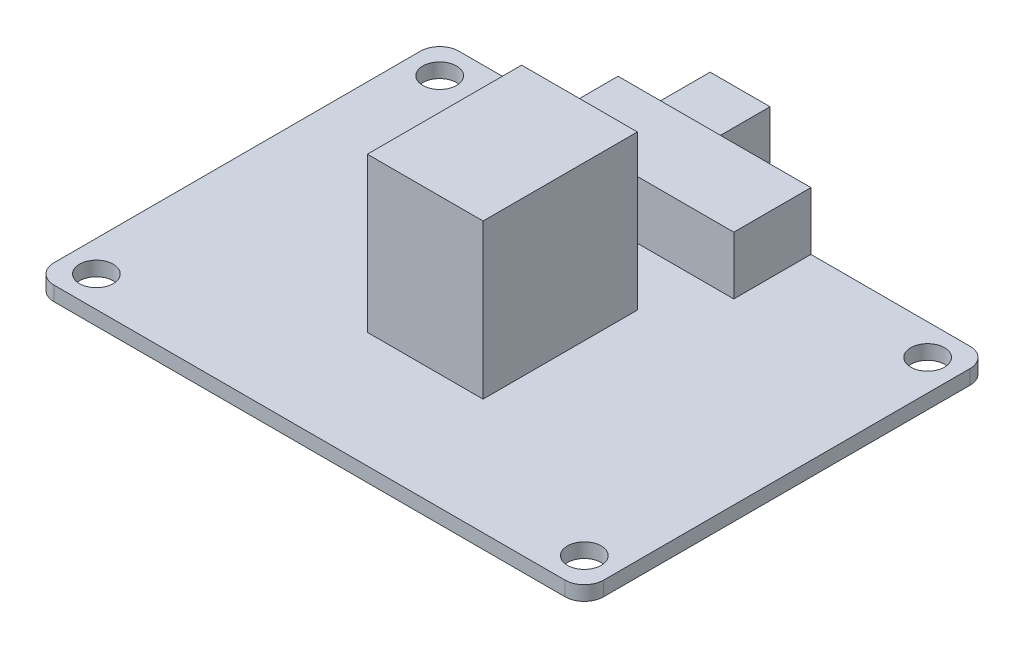
ISO-10303-21;
HEADER;
FILE_DESCRIPTION(('STEP AP214'),'2;1');
FILE_NAME('part.step','',(''),(''),'','','');
FILE_SCHEMA(('AUTOMOTIVE_DESIGN { 1 0 10303 214 1 1 1 1 }'));
ENDSEC;
DATA;
#1=APPLICATION_CONTEXT('core data for automotive mechanical design processes');
#2=APPLICATION_PROTOCOL_DEFINITION('international standard','automotive_design',2000,#1);
#3=PRODUCT_CONTEXT('',#1,'mechanical');
#4=PRODUCT('Part','Part','',(#3));
#5=PRODUCT_RELATED_PRODUCT_CATEGORY('part','',(#4));
#6=PRODUCT_DEFINITION_FORMATION('','',#4);
#7=PRODUCT_DEFINITION_CONTEXT('part definition',#1,'design');
#8=PRODUCT_DEFINITION('design','',#6,#7);
#9=PRODUCT_DEFINITION_SHAPE('','',#8);
#10=(LENGTH_UNIT() NAMED_UNIT(*) SI_UNIT(.MILLI.,.METRE.));
#11=(NAMED_UNIT(*) PLANE_ANGLE_UNIT() SI_UNIT($,.RADIAN.));
#12=(NAMED_UNIT(*) SI_UNIT($,.STERADIAN.) SOLID_ANGLE_UNIT());
#13=UNCERTAINTY_MEASURE_WITH_UNIT(LENGTH_MEASURE(1.E-05),#10,'distance_accuracy_value','');
#14=(GEOMETRIC_REPRESENTATION_CONTEXT(3) GLOBAL_UNCERTAINTY_ASSIGNED_CONTEXT((#13)) GLOBAL_UNIT_ASSIGNED_CONTEXT((#10,
#11,#12)) REPRESENTATION_CONTEXT('',''));
#15=CARTESIAN_POINT('',(0.,0.,0.));
#16=DIRECTION('',(0.,0.,1.));
#17=DIRECTION('',(1.,0.,0.));
#18=AXIS2_PLACEMENT_3D('',#15,#16,#17);
#19=CARTESIAN_POINT('',(-28.5,1.5,-21.));
#20=DIRECTION('',(0.,0.,1.));
#21=DIRECTION('',(1.,0.,0.));
#22=AXIS2_PLACEMENT_3D('',#19,#20,#21);
#23=PLANE('',#22);
#24=DIRECTION('',(-1.,0.,0.));
#25=VECTOR('',#24,1.);
#26=CARTESIAN_POINT('',(-28.5,0.,-21.));
#27=LINE('',#26,#25);
#28=CARTESIAN_POINT('',(26.5,0.,-21.));
#29=VERTEX_POINT('',#28);
#30=CARTESIAN_POINT('',(-26.5,0.,-21.));
#31=VERTEX_POINT('',#30);
#32=EDGE_CURVE('E303',#29,#31,#27,.T.);
#33=ORIENTED_EDGE('',*,*,#32,.T.);
#34=DIRECTION('',(0.,-1.,0.));
#35=VECTOR('',#34,1.);
#36=CARTESIAN_POINT('',(-26.5,1.5,-21.));
#37=LINE('',#36,#35);
#38=CARTESIAN_POINT('',(-26.5,1.5,-21.));
#39=VERTEX_POINT('',#38);
#40=EDGE_CURVE('E337',#31,#39,#37,.F.);
#41=ORIENTED_EDGE('',*,*,#40,.T.);
#42=DIRECTION('',(-1.,0.,0.));
#43=VECTOR('',#42,1.);
#44=CARTESIAN_POINT('',(-28.5,1.5,-21.));
#45=LINE('',#44,#43);
#46=CARTESIAN_POINT('',(-10.,1.5,-21.));
#47=VERTEX_POINT('',#46);
#48=EDGE_CURVE('E291',#47,#39,#45,.T.);
#49=ORIENTED_EDGE('',*,*,#48,.F.);
#50=DIRECTION('',(0.,-1.,0.));
#51=VECTOR('',#50,1.);
#52=CARTESIAN_POINT('',(-10.,7.5,-21.));
#53=LINE('',#52,#51);
#54=CARTESIAN_POINT('',(-10.,7.5,-21.));
#55=VERTEX_POINT('',#54);
#56=EDGE_CURVE('E256',#55,#47,#53,.T.);
#57=ORIENTED_EDGE('',*,*,#56,.F.);
#58=DIRECTION('',(-1.,0.,0.));
#59=VECTOR('',#58,1.);
#60=CARTESIAN_POINT('',(10.,7.5,-21.));
#61=LINE('',#60,#59);
#62=CARTESIAN_POINT('',(10.,7.5,-21.));
#63=VERTEX_POINT('',#62);
#64=EDGE_CURVE('E236',#63,#55,#61,.T.);
#65=ORIENTED_EDGE('',*,*,#64,.F.);
#66=DIRECTION('',(0.,-1.,0.));
#67=VECTOR('',#66,1.);
#68=CARTESIAN_POINT('',(10.,7.5,-21.));
#69=LINE('',#68,#67);
#70=CARTESIAN_POINT('',(9.99999999999999,1.5,-21.));
#71=VERTEX_POINT('',#70);
#72=EDGE_CURVE('E259',#63,#71,#69,.T.);
#73=ORIENTED_EDGE('',*,*,#72,.T.);
#74=CARTESIAN_POINT('',(26.5,1.5,-21.));
#75=VERTEX_POINT('',#74);
#76=EDGE_CURVE('E293',#75,#71,#45,.T.);
#77=ORIENTED_EDGE('',*,*,#76,.F.);
#78=DIRECTION('',(0.,-1.,0.));
#79=VECTOR('',#78,1.);
#80=CARTESIAN_POINT('',(26.5,1.5,-21.));
#81=LINE('',#80,#79);
#82=EDGE_CURVE('E334',#75,#29,#81,.T.);
#83=ORIENTED_EDGE('',*,*,#82,.T.);
#84=EDGE_LOOP('',(#33,#41,#49,#57,#65,#73,#77,#83));
#85=FACE_BOUND('',#84,.T.);
#86=DIRECTION('',(0.,-1.,0.));
#87=VECTOR('',#86,1.);
#88=CARTESIAN_POINT('',(-0.243519270313228,6.6417913349698,-21.));
#89=LINE('',#88,#87);
#90=CARTESIAN_POINT('',(-0.243519270313228,6.6417913349698,-21.));
#91=VERTEX_POINT('',#90);
#92=CARTESIAN_POINT('',(-0.243519270313228,1.58876647597019,-21.));
#93=VERTEX_POINT('',#92);
#94=EDGE_CURVE('E199',#91,#93,#89,.T.);
#95=ORIENTED_EDGE('',*,*,#94,.F.);
#96=DIRECTION('',(1.,0.,0.));
#97=VECTOR('',#96,1.);
#98=CARTESIAN_POINT('',(-0.243519270313228,6.6417913349698,-21.));
#99=LINE('',#98,#97);
#100=CARTESIAN_POINT('',(-6.45326066330069,6.6417913349698,-21.));
#101=VERTEX_POINT('',#100);
#102=EDGE_CURVE('E204',#101,#91,#99,.T.);
#103=ORIENTED_EDGE('',*,*,#102,.F.);
#104=DIRECTION('',(0.,1.,0.));
#105=VECTOR('',#104,1.);
#106=CARTESIAN_POINT('',(-6.45326066330069,6.6417913349698,-21.));
#107=LINE('',#106,#105);
#108=CARTESIAN_POINT('',(-6.45326066330069,1.58876647597019,-21.));
#109=VERTEX_POINT('',#108);
#110=EDGE_CURVE('E216',#109,#101,#107,.T.);
#111=ORIENTED_EDGE('',*,*,#110,.F.);
#112=DIRECTION('',(-1.,0.,0.));
#113=VECTOR('',#112,1.);
#114=CARTESIAN_POINT('',(-0.243519270313228,1.58876647597019,-21.));
#115=LINE('',#114,#113);
#116=EDGE_CURVE('E213',#93,#109,#115,.T.);
#117=ORIENTED_EDGE('',*,*,#116,.F.);
#118=EDGE_LOOP('',(#95,#103,#111,#117));
#119=FACE_BOUND('',#118,.T.);
#120=ADVANCED_FACE('F32',(#85,#119),#23,.F.);
#121=CARTESIAN_POINT('',(0.,1.5,0.));
#122=DIRECTION('',(0.,-1.,0.));
#123=DIRECTION('',(0.,0.,-1.));
#124=AXIS2_PLACEMENT_3D('',#121,#122,#123);
#125=PLANE('',#124);
#126=DIRECTION('',(0.,0.,-1.));
#127=VECTOR('',#126,1.);
#128=CARTESIAN_POINT('',(6.,1.5,-7.));
#129=LINE('',#128,#127);
#130=CARTESIAN_POINT('',(6.,1.5,9.));
#131=VERTEX_POINT('',#130);
#132=CARTESIAN_POINT('',(6.,1.5,-7.));
#133=VERTEX_POINT('',#132);
#134=EDGE_CURVE('E262',#131,#133,#129,.T.);
#135=ORIENTED_EDGE('',*,*,#134,.F.);
#136=DIRECTION('',(1.,0.,0.));
#137=VECTOR('',#136,1.);
#138=CARTESIAN_POINT('',(6.,1.5,9.));
#139=LINE('',#138,#137);
#140=CARTESIAN_POINT('',(-6.,1.5,9.));
#141=VERTEX_POINT('',#140);
#142=EDGE_CURVE('E176',#141,#131,#139,.T.);
#143=ORIENTED_EDGE('',*,*,#142,.F.);
#144=DIRECTION('',(0.,0.,1.));
#145=VECTOR('',#144,1.);
#146=CARTESIAN_POINT('',(-6.,1.5,-7.));
#147=LINE('',#146,#145);
#148=CARTESIAN_POINT('',(-6.,1.5,-7.));
#149=VERTEX_POINT('',#148);
#150=EDGE_CURVE('E267',#149,#141,#147,.T.);
#151=ORIENTED_EDGE('',*,*,#150,.F.);
#152=DIRECTION('',(-1.,0.,0.));
#153=VECTOR('',#152,1.);
#154=CARTESIAN_POINT('',(6.,1.5,-7.));
#155=LINE('',#154,#153);
#156=EDGE_CURVE('E264',#133,#149,#155,.T.);
#157=ORIENTED_EDGE('',*,*,#156,.F.);
#158=EDGE_LOOP('',(#135,#143,#151,#157));
#159=FACE_BOUND('',#158,.T.);
#160=CARTESIAN_POINT('',(-25.3,1.5,-17.8));
#161=DIRECTION('',(0.,1.,0.));
#162=DIRECTION('',(0.,0.,1.));
#163=AXIS2_PLACEMENT_3D('',#160,#161,#162);
#164=CIRCLE('',#163,1.75);
#165=CARTESIAN_POINT('',(-25.3,1.5,-16.05));
#166=VERTEX_POINT('',#165);
#167=EDGE_CURVE('E280',#166,#166,#164,.T.);
#168=ORIENTED_EDGE('',*,*,#167,.F.);
#169=EDGE_LOOP('',(#168));
#170=FACE_BOUND('',#169,.T.);
#171=CARTESIAN_POINT('',(25.3,1.5,17.8));
#172=DIRECTION('',(0.,1.,0.));
#173=DIRECTION('',(0.,0.,1.));
#174=AXIS2_PLACEMENT_3D('',#171,#172,#173);
#175=CIRCLE('',#174,1.75);
#176=CARTESIAN_POINT('',(25.3,1.5,19.55));
#177=VERTEX_POINT('',#176);
#178=EDGE_CURVE('E279',#177,#177,#175,.T.);
#179=ORIENTED_EDGE('',*,*,#178,.F.);
#180=EDGE_LOOP('',(#179));
#181=FACE_BOUND('',#180,.T.);
#182=CARTESIAN_POINT('',(25.3,1.5,-17.8));
#183=DIRECTION('',(0.,1.,0.));
#184=DIRECTION('',(0.,0.,1.));
#185=AXIS2_PLACEMENT_3D('',#182,#183,#184);
#186=CIRCLE('',#185,1.75);
#187=CARTESIAN_POINT('',(25.3,1.5,-16.05));
#188=VERTEX_POINT('',#187);
#189=EDGE_CURVE('E276',#188,#188,#186,.T.);
#190=ORIENTED_EDGE('',*,*,#189,.F.);
#191=EDGE_LOOP('',(#190));
#192=FACE_BOUND('',#191,.T.);
#193=CARTESIAN_POINT('',(-25.3,1.5,17.8));
#194=DIRECTION('',(0.,1.,0.));
#195=DIRECTION('',(0.,0.,1.));
#196=AXIS2_PLACEMENT_3D('',#193,#194,#195);
#197=CIRCLE('',#196,1.75);
#198=CARTESIAN_POINT('',(-25.3,1.5,19.55));
#199=VERTEX_POINT('',#198);
#200=EDGE_CURVE('E283',#199,#199,#197,.T.);
#201=ORIENTED_EDGE('',*,*,#200,.F.);
#202=EDGE_LOOP('',(#201));
#203=FACE_BOUND('',#202,.T.);
#204=ORIENTED_EDGE('',*,*,#48,.T.);
#205=CARTESIAN_POINT('',(-26.5,1.5,-19.));
#206=DIRECTION('',(0.,-1.,0.));
#207=DIRECTION('',(0.,0.,-1.));
#208=AXIS2_PLACEMENT_3D('',#205,#206,#207);
#209=CIRCLE('',#208,2.);
#210=CARTESIAN_POINT('',(-28.5,1.5,-19.));
#211=VERTEX_POINT('',#210);
#212=EDGE_CURVE('E344',#39,#211,#209,.F.);
#213=ORIENTED_EDGE('',*,*,#212,.T.);
#214=DIRECTION('',(0.,0.,1.));
#215=VECTOR('',#214,1.);
#216=CARTESIAN_POINT('',(-28.5,1.5,21.));
#217=LINE('',#216,#215);
#218=CARTESIAN_POINT('',(-28.5,1.5,19.));
#219=VERTEX_POINT('',#218);
#220=EDGE_CURVE('E295',#211,#219,#217,.T.);
#221=ORIENTED_EDGE('',*,*,#220,.T.);
#222=CARTESIAN_POINT('',(-26.5,1.5,19.));
#223=DIRECTION('',(0.,-1.,0.));
#224=DIRECTION('',(0.,0.,-1.));
#225=AXIS2_PLACEMENT_3D('',#222,#223,#224);
#226=CIRCLE('',#225,2.);
#227=CARTESIAN_POINT('',(-26.5,1.5,21.));
#228=VERTEX_POINT('',#227);
#229=EDGE_CURVE('E342',#219,#228,#226,.F.);
#230=ORIENTED_EDGE('',*,*,#229,.T.);
#231=DIRECTION('',(1.,0.,0.));
#232=VECTOR('',#231,1.);
#233=CARTESIAN_POINT('',(-28.5,1.5,21.));
#234=LINE('',#233,#232);
#235=CARTESIAN_POINT('',(26.5,1.5,21.));
#236=VERTEX_POINT('',#235);
#237=EDGE_CURVE('E298',#228,#236,#234,.T.);
#238=ORIENTED_EDGE('',*,*,#237,.T.);
#239=CARTESIAN_POINT('',(26.5,1.5,19.));
#240=DIRECTION('',(0.,-1.,0.));
#241=DIRECTION('',(0.,0.,-1.));
#242=AXIS2_PLACEMENT_3D('',#239,#240,#241);
#243=CIRCLE('',#242,2.);
#244=CARTESIAN_POINT('',(28.5,1.5,19.));
#245=VERTEX_POINT('',#244);
#246=EDGE_CURVE('E52',#236,#245,#243,.F.);
#247=ORIENTED_EDGE('',*,*,#246,.T.);
#248=DIRECTION('',(0.,0.,-1.));
#249=VECTOR('',#248,1.);
#250=CARTESIAN_POINT('',(28.5,1.5,21.));
#251=LINE('',#250,#249);
#252=CARTESIAN_POINT('',(28.5,1.5,-19.));
#253=VERTEX_POINT('',#252);
#254=EDGE_CURVE('E289',#245,#253,#251,.T.);
#255=ORIENTED_EDGE('',*,*,#254,.T.);
#256=CARTESIAN_POINT('',(26.5,1.5,-19.));
#257=DIRECTION('',(0.,-1.,0.));
#258=DIRECTION('',(0.,0.,-1.));
#259=AXIS2_PLACEMENT_3D('',#256,#257,#258);
#260=CIRCLE('',#259,2.);
#261=EDGE_CURVE('E340',#253,#75,#260,.F.);
#262=ORIENTED_EDGE('',*,*,#261,.T.);
#263=ORIENTED_EDGE('',*,*,#76,.T.);
#264=DIRECTION('',(0.,0.,-1.));
#265=VECTOR('',#264,1.);
#266=CARTESIAN_POINT('',(10.,1.5,-13.));
#267=LINE('',#266,#265);
#268=CARTESIAN_POINT('',(10.,1.5,-13.));
#269=VERTEX_POINT('',#268);
#270=EDGE_CURVE('E232',#269,#71,#267,.T.);
#271=ORIENTED_EDGE('',*,*,#270,.F.);
#272=DIRECTION('',(1.,0.,0.));
#273=VECTOR('',#272,1.);
#274=CARTESIAN_POINT('',(10.,1.5,-13.));
#275=LINE('',#274,#273);
#276=CARTESIAN_POINT('',(-10.,1.5,-13.));
#277=VERTEX_POINT('',#276);
#278=EDGE_CURVE('E237',#277,#269,#275,.T.);
#279=ORIENTED_EDGE('',*,*,#278,.F.);
#280=DIRECTION('',(0.,0.,1.));
#281=VECTOR('',#280,1.);
#282=CARTESIAN_POINT('',(-10.,1.5,-13.));
#283=LINE('',#282,#281);
#284=EDGE_CURVE('E246',#47,#277,#283,.T.);
#285=ORIENTED_EDGE('',*,*,#284,.F.);
#286=EDGE_LOOP('',(#204,#213,#221,#230,#238,#247,#255,#262,#263,#271,#279,#285));
#287=FACE_BOUND('',#286,.T.);
#288=ADVANCED_FACE('F370',(#159,#170,#181,#192,#203,#287),#125,.F.);
#289=CARTESIAN_POINT('',(28.5,1.5,21.));
#290=DIRECTION('',(-1.,0.,0.));
#291=DIRECTION('',(0.,0.,1.));
#292=AXIS2_PLACEMENT_3D('',#289,#290,#291);
#293=PLANE('',#292);
#294=DIRECTION('',(0.,0.,-1.));
#295=VECTOR('',#294,1.);
#296=CARTESIAN_POINT('',(28.5,0.,21.));
#297=LINE('',#296,#295);
#298=CARTESIAN_POINT('',(28.5,0.,19.));
#299=VERTEX_POINT('',#298);
#300=CARTESIAN_POINT('',(28.5,0.,-19.));
#301=VERTEX_POINT('',#300);
#302=EDGE_CURVE('E301',#299,#301,#297,.T.);
#303=ORIENTED_EDGE('',*,*,#302,.T.);
#304=DIRECTION('',(0.,-1.,0.));
#305=VECTOR('',#304,1.);
#306=CARTESIAN_POINT('',(28.5,1.5,-19.));
#307=LINE('',#306,#305);
#308=EDGE_CURVE('E11',#301,#253,#307,.F.);
#309=ORIENTED_EDGE('',*,*,#308,.T.);
#310=ORIENTED_EDGE('',*,*,#254,.F.);
#311=DIRECTION('',(0.,-1.,0.));
#312=VECTOR('',#311,1.);
#313=CARTESIAN_POINT('',(28.5,1.5,19.));
#314=LINE('',#313,#312);
#315=EDGE_CURVE('E40',#245,#299,#314,.T.);
#316=ORIENTED_EDGE('',*,*,#315,.T.);
#317=EDGE_LOOP('',(#303,#309,#310,#316));
#318=FACE_BOUND('',#317,.T.);
#319=ADVANCED_FACE('F353',(#318),#293,.F.);
#320=CARTESIAN_POINT('',(-28.5,1.5,21.));
#321=DIRECTION('',(1.,0.,0.));
#322=DIRECTION('',(0.,0.,-1.));
#323=AXIS2_PLACEMENT_3D('',#320,#321,#322);
#324=PLANE('',#323);
#325=ORIENTED_EDGE('',*,*,#220,.F.);
#326=DIRECTION('',(0.,-1.,0.));
#327=VECTOR('',#326,1.);
#328=CARTESIAN_POINT('',(-28.5,1.5,-19.));
#329=LINE('',#328,#327);
#330=CARTESIAN_POINT('',(-28.5,0.,-19.));
#331=VERTEX_POINT('',#330);
#332=EDGE_CURVE('E323',#211,#331,#329,.T.);
#333=ORIENTED_EDGE('',*,*,#332,.T.);
#334=DIRECTION('',(0.,0.,1.));
#335=VECTOR('',#334,1.);
#336=CARTESIAN_POINT('',(-28.5,0.,21.));
#337=LINE('',#336,#335);
#338=CARTESIAN_POINT('',(-28.5,0.,19.));
#339=VERTEX_POINT('',#338);
#340=EDGE_CURVE('E307',#331,#339,#337,.T.);
#341=ORIENTED_EDGE('',*,*,#340,.T.);
#342=DIRECTION('',(0.,-1.,0.));
#343=VECTOR('',#342,1.);
#344=CARTESIAN_POINT('',(-28.5,1.5,19.));
#345=LINE('',#344,#343);
#346=EDGE_CURVE('E300',#339,#219,#345,.F.);
#347=ORIENTED_EDGE('',*,*,#346,.T.);
#348=EDGE_LOOP('',(#325,#333,#341,#347));
#349=FACE_BOUND('',#348,.T.);
#350=ADVANCED_FACE('F392',(#349),#324,.F.);
#351=CARTESIAN_POINT('',(-28.5,1.5,21.));
#352=DIRECTION('',(0.,0.,-1.));
#353=DIRECTION('',(-1.,0.,0.));
#354=AXIS2_PLACEMENT_3D('',#351,#352,#353);
#355=PLANE('',#354);
#356=ORIENTED_EDGE('',*,*,#237,.F.);
#357=DIRECTION('',(0.,-1.,0.));
#358=VECTOR('',#357,1.);
#359=CARTESIAN_POINT('',(-26.5,1.5,21.));
#360=LINE('',#359,#358);
#361=CARTESIAN_POINT('',(-26.5,0.,21.));
#362=VERTEX_POINT('',#361);
#363=EDGE_CURVE('E348',#228,#362,#360,.T.);
#364=ORIENTED_EDGE('',*,*,#363,.T.);
#365=DIRECTION('',(1.,0.,0.));
#366=VECTOR('',#365,1.);
#367=CARTESIAN_POINT('',(-28.5,0.,21.));
#368=LINE('',#367,#366);
#369=CARTESIAN_POINT('',(26.5,0.,21.));
#370=VERTEX_POINT('',#369);
#371=EDGE_CURVE('E292',#362,#370,#368,.T.);
#372=ORIENTED_EDGE('',*,*,#371,.T.);
#373=DIRECTION('',(0.,-1.,0.));
#374=VECTOR('',#373,1.);
#375=CARTESIAN_POINT('',(26.5,1.5,21.));
#376=LINE('',#375,#374);
#377=EDGE_CURVE('E346',#370,#236,#376,.F.);
#378=ORIENTED_EDGE('',*,*,#377,.T.);
#379=EDGE_LOOP('',(#356,#364,#372,#378));
#380=FACE_BOUND('',#379,.T.);
#381=ADVANCED_FACE('F400',(#380),#355,.F.);
#382=CARTESIAN_POINT('',(0.,0.,0.));
#383=DIRECTION('',(0.,-1.,0.));
#384=DIRECTION('',(0.,0.,-1.));
#385=AXIS2_PLACEMENT_3D('',#382,#383,#384);
#386=PLANE('',#385);
#387=CARTESIAN_POINT('',(-25.3,0.,-17.8));
#388=DIRECTION('',(0.,-1.,0.));
#389=DIRECTION('',(0.,0.,-1.));
#390=AXIS2_PLACEMENT_3D('',#387,#388,#389);
#391=CIRCLE('',#390,1.75);
#392=CARTESIAN_POINT('',(-25.3,0.,-19.55));
#393=VERTEX_POINT('',#392);
#394=EDGE_CURVE('E304',#393,#393,#391,.T.);
#395=ORIENTED_EDGE('',*,*,#394,.F.);
#396=EDGE_LOOP('',(#395));
#397=FACE_BOUND('',#396,.T.);
#398=CARTESIAN_POINT('',(25.3,0.,17.8));
#399=DIRECTION('',(0.,-1.,0.));
#400=DIRECTION('',(0.,0.,-1.));
#401=AXIS2_PLACEMENT_3D('',#398,#399,#400);
#402=CIRCLE('',#401,1.75);
#403=CARTESIAN_POINT('',(25.3,0.,16.05));
#404=VERTEX_POINT('',#403);
#405=EDGE_CURVE('E317',#404,#404,#402,.T.);
#406=ORIENTED_EDGE('',*,*,#405,.F.);
#407=EDGE_LOOP('',(#406));
#408=FACE_BOUND('',#407,.T.);
#409=CARTESIAN_POINT('',(25.3,0.,-17.8));
#410=DIRECTION('',(0.,-1.,0.));
#411=DIRECTION('',(0.,0.,-1.));
#412=AXIS2_PLACEMENT_3D('',#409,#410,#411);
#413=CIRCLE('',#412,1.75);
#414=CARTESIAN_POINT('',(25.3,0.,-19.55));
#415=VERTEX_POINT('',#414);
#416=EDGE_CURVE('E314',#415,#415,#413,.T.);
#417=ORIENTED_EDGE('',*,*,#416,.F.);
#418=EDGE_LOOP('',(#417));
#419=FACE_BOUND('',#418,.T.);
#420=CARTESIAN_POINT('',(-25.3,0.,17.8));
#421=DIRECTION('',(0.,-1.,0.));
#422=DIRECTION('',(0.,0.,-1.));
#423=AXIS2_PLACEMENT_3D('',#420,#421,#422);
#424=CIRCLE('',#423,1.75);
#425=CARTESIAN_POINT('',(-25.3,0.,16.05));
#426=VERTEX_POINT('',#425);
#427=EDGE_CURVE('E288',#426,#426,#424,.T.);
#428=ORIENTED_EDGE('',*,*,#427,.F.);
#429=EDGE_LOOP('',(#428));
#430=FACE_BOUND('',#429,.T.);
#431=ORIENTED_EDGE('',*,*,#340,.F.);
#432=CARTESIAN_POINT('',(-26.5,0.,-19.));
#433=DIRECTION('',(0.,-1.,0.));
#434=DIRECTION('',(0.,0.,-1.));
#435=AXIS2_PLACEMENT_3D('',#432,#433,#434);
#436=CIRCLE('',#435,2.);
#437=EDGE_CURVE('E332',#331,#31,#436,.T.);
#438=ORIENTED_EDGE('',*,*,#437,.T.);
#439=ORIENTED_EDGE('',*,*,#32,.F.);
#440=CARTESIAN_POINT('',(26.5,0.,-19.));
#441=DIRECTION('',(0.,-1.,0.));
#442=DIRECTION('',(0.,0.,-1.));
#443=AXIS2_PLACEMENT_3D('',#440,#441,#442);
#444=CIRCLE('',#443,2.);
#445=EDGE_CURVE('E328',#29,#301,#444,.T.);
#446=ORIENTED_EDGE('',*,*,#445,.T.);
#447=ORIENTED_EDGE('',*,*,#302,.F.);
#448=CARTESIAN_POINT('',(26.5,0.,19.));
#449=DIRECTION('',(0.,-1.,0.));
#450=DIRECTION('',(0.,0.,-1.));
#451=AXIS2_PLACEMENT_3D('',#448,#449,#450);
#452=CIRCLE('',#451,2.);
#453=EDGE_CURVE('E326',#299,#370,#452,.T.);
#454=ORIENTED_EDGE('',*,*,#453,.T.);
#455=ORIENTED_EDGE('',*,*,#371,.F.);
#456=CARTESIAN_POINT('',(-26.5,0.,19.));
#457=DIRECTION('',(0.,-1.,0.));
#458=DIRECTION('',(0.,0.,-1.));
#459=AXIS2_PLACEMENT_3D('',#456,#457,#458);
#460=CIRCLE('',#459,2.);
#461=EDGE_CURVE('E330',#362,#339,#460,.T.);
#462=ORIENTED_EDGE('',*,*,#461,.T.);
#463=EDGE_LOOP('',(#431,#438,#439,#446,#447,#454,#455,#462));
#464=FACE_BOUND('',#463,.T.);
#465=ADVANCED_FACE('F357',(#397,#408,#419,#430,#464),#386,.T.);
#466=CARTESIAN_POINT('',(-25.3,-8.5,17.8));
#467=DIRECTION('',(0.,1.,0.));
#468=DIRECTION('',(0.,0.,1.));
#469=AXIS2_PLACEMENT_3D('',#466,#467,#468);
#470=CYLINDRICAL_SURFACE('',#469,1.75);
#471=ORIENTED_EDGE('',*,*,#427,.T.);
#472=EDGE_LOOP('',(#471));
#473=FACE_BOUND('',#472,.T.);
#474=ORIENTED_EDGE('',*,*,#200,.T.);
#475=EDGE_LOOP('',(#474));
#476=FACE_BOUND('',#475,.T.);
#477=ADVANCED_FACE('F582',(#473,#476),#470,.F.);
#478=CARTESIAN_POINT('',(25.3,-8.5,-17.8));
#479=DIRECTION('',(0.,1.,0.));
#480=DIRECTION('',(0.,0.,1.));
#481=AXIS2_PLACEMENT_3D('',#478,#479,#480);
#482=CYLINDRICAL_SURFACE('',#481,1.75);
#483=ORIENTED_EDGE('',*,*,#416,.T.);
#484=EDGE_LOOP('',(#483));
#485=FACE_BOUND('',#484,.T.);
#486=ORIENTED_EDGE('',*,*,#189,.T.);
#487=EDGE_LOOP('',(#486));
#488=FACE_BOUND('',#487,.T.);
#489=ADVANCED_FACE('F601',(#485,#488),#482,.F.);
#490=CARTESIAN_POINT('',(25.3,-8.5,17.8));
#491=DIRECTION('',(0.,1.,0.));
#492=DIRECTION('',(0.,0.,1.));
#493=AXIS2_PLACEMENT_3D('',#490,#491,#492);
#494=CYLINDRICAL_SURFACE('',#493,1.75);
#495=ORIENTED_EDGE('',*,*,#405,.T.);
#496=EDGE_LOOP('',(#495));
#497=FACE_BOUND('',#496,.T.);
#498=ORIENTED_EDGE('',*,*,#178,.T.);
#499=EDGE_LOOP('',(#498));
#500=FACE_BOUND('',#499,.T.);
#501=ADVANCED_FACE('F610',(#497,#500),#494,.F.);
#502=CARTESIAN_POINT('',(-25.3,-8.5,-17.8));
#503=DIRECTION('',(0.,1.,0.));
#504=DIRECTION('',(0.,0.,1.));
#505=AXIS2_PLACEMENT_3D('',#502,#503,#504);
#506=CYLINDRICAL_SURFACE('',#505,1.75);
#507=ORIENTED_EDGE('',*,*,#394,.T.);
#508=EDGE_LOOP('',(#507));
#509=FACE_BOUND('',#508,.T.);
#510=ORIENTED_EDGE('',*,*,#167,.T.);
#511=EDGE_LOOP('',(#510));
#512=FACE_BOUND('',#511,.T.);
#513=ADVANCED_FACE('F449',(#509,#512),#506,.F.);
#514=CARTESIAN_POINT('',(6.,7.5,-7.));
#515=DIRECTION('',(-1.,0.,0.));
#516=DIRECTION('',(0.,0.,1.));
#517=AXIS2_PLACEMENT_3D('',#514,#515,#516);
#518=PLANE('',#517);
#519=ORIENTED_EDGE('',*,*,#134,.T.);
#520=DIRECTION('',(0.,-1.,0.));
#521=VECTOR('',#520,1.);
#522=CARTESIAN_POINT('',(6.,7.5,-7.));
#523=LINE('',#522,#521);
#524=CARTESIAN_POINT('',(6.,17.5,-7.));
#525=VERTEX_POINT('',#524);
#526=EDGE_CURVE('E185',#525,#133,#523,.T.);
#527=ORIENTED_EDGE('',*,*,#526,.F.);
#528=DIRECTION('',(0.,0.,-1.));
#529=VECTOR('',#528,1.);
#530=CARTESIAN_POINT('',(6.,17.5,9.));
#531=LINE('',#530,#529);
#532=CARTESIAN_POINT('',(6.,17.5,9.));
#533=VERTEX_POINT('',#532);
#534=EDGE_CURVE('E182',#533,#525,#531,.T.);
#535=ORIENTED_EDGE('',*,*,#534,.F.);
#536=DIRECTION('',(0.,-1.,0.));
#537=VECTOR('',#536,1.);
#538=CARTESIAN_POINT('',(6.,7.5,9.));
#539=LINE('',#538,#537);
#540=EDGE_CURVE('E170',#533,#131,#539,.T.);
#541=ORIENTED_EDGE('',*,*,#540,.T.);
#542=EDGE_LOOP('',(#519,#527,#535,#541));
#543=FACE_BOUND('',#542,.T.);
#544=ADVANCED_FACE('F183',(#543),#518,.F.);
#545=CARTESIAN_POINT('',(6.,7.5,-7.));
#546=DIRECTION('',(0.,0.,1.));
#547=DIRECTION('',(1.,0.,0.));
#548=AXIS2_PLACEMENT_3D('',#545,#546,#547);
#549=PLANE('',#548);
#550=ORIENTED_EDGE('',*,*,#156,.T.);
#551=DIRECTION('',(0.,-1.,0.));
#552=VECTOR('',#551,1.);
#553=CARTESIAN_POINT('',(-6.,7.5,-7.));
#554=LINE('',#553,#552);
#555=CARTESIAN_POINT('',(-6.,17.5,-7.));
#556=VERTEX_POINT('',#555);
#557=EDGE_CURVE('E272',#556,#149,#554,.T.);
#558=ORIENTED_EDGE('',*,*,#557,.F.);
#559=DIRECTION('',(-1.,0.,0.));
#560=VECTOR('',#559,1.);
#561=CARTESIAN_POINT('',(6.,17.5,-7.));
#562=LINE('',#561,#560);
#563=EDGE_CURVE('E189',#525,#556,#562,.T.);
#564=ORIENTED_EDGE('',*,*,#563,.F.);
#565=ORIENTED_EDGE('',*,*,#526,.T.);
#566=EDGE_LOOP('',(#550,#558,#564,#565));
#567=FACE_BOUND('',#566,.T.);
#568=ADVANCED_FACE('F448',(#567),#549,.F.);
#569=CARTESIAN_POINT('',(-6.,7.5,-7.));
#570=DIRECTION('',(1.,0.,0.));
#571=DIRECTION('',(0.,0.,-1.));
#572=AXIS2_PLACEMENT_3D('',#569,#570,#571);
#573=PLANE('',#572);
#574=ORIENTED_EDGE('',*,*,#150,.T.);
#575=DIRECTION('',(0.,-1.,0.));
#576=VECTOR('',#575,1.);
#577=CARTESIAN_POINT('',(-6.,7.5,9.));
#578=LINE('',#577,#576);
#579=CARTESIAN_POINT('',(-6.,17.5,9.));
#580=VERTEX_POINT('',#579);
#581=EDGE_CURVE('E179',#580,#141,#578,.T.);
#582=ORIENTED_EDGE('',*,*,#581,.F.);
#583=DIRECTION('',(0.,0.,1.));
#584=VECTOR('',#583,1.);
#585=CARTESIAN_POINT('',(-6.,17.5,-7.));
#586=LINE('',#585,#584);
#587=EDGE_CURVE('E194',#556,#580,#586,.T.);
#588=ORIENTED_EDGE('',*,*,#587,.F.);
#589=ORIENTED_EDGE('',*,*,#557,.T.);
#590=EDGE_LOOP('',(#574,#582,#588,#589));
#591=FACE_BOUND('',#590,.T.);
#592=ADVANCED_FACE('F460',(#591),#573,.F.);
#593=CARTESIAN_POINT('',(6.,7.5,9.));
#594=DIRECTION('',(0.,0.,-1.));
#595=DIRECTION('',(-1.,0.,0.));
#596=AXIS2_PLACEMENT_3D('',#593,#594,#595);
#597=PLANE('',#596);
#598=ORIENTED_EDGE('',*,*,#142,.T.);
#599=ORIENTED_EDGE('',*,*,#540,.F.);
#600=DIRECTION('',(1.,0.,0.));
#601=VECTOR('',#600,1.);
#602=CARTESIAN_POINT('',(-6.,17.5,9.));
#603=LINE('',#602,#601);
#604=EDGE_CURVE('E175',#580,#533,#603,.T.);
#605=ORIENTED_EDGE('',*,*,#604,.F.);
#606=ORIENTED_EDGE('',*,*,#581,.T.);
#607=EDGE_LOOP('',(#598,#599,#605,#606));
#608=FACE_BOUND('',#607,.T.);
#609=ADVANCED_FACE('F172',(#608),#597,.F.);
#610=CARTESIAN_POINT('',(10.,7.5,-13.));
#611=DIRECTION('',(-1.,0.,0.));
#612=DIRECTION('',(0.,0.,1.));
#613=AXIS2_PLACEMENT_3D('',#610,#611,#612);
#614=PLANE('',#613);
#615=ORIENTED_EDGE('',*,*,#270,.T.);
#616=ORIENTED_EDGE('',*,*,#72,.F.);
#617=DIRECTION('',(0.,0.,-1.));
#618=VECTOR('',#617,1.);
#619=CARTESIAN_POINT('',(10.,7.5,-13.));
#620=LINE('',#619,#618);
#621=CARTESIAN_POINT('',(10.,7.5,-13.));
#622=VERTEX_POINT('',#621);
#623=EDGE_CURVE('E233',#622,#63,#620,.T.);
#624=ORIENTED_EDGE('',*,*,#623,.F.);
#625=DIRECTION('',(0.,-1.,0.));
#626=VECTOR('',#625,1.);
#627=CARTESIAN_POINT('',(10.,7.5,-13.));
#628=LINE('',#627,#626);
#629=EDGE_CURVE('E243',#622,#269,#628,.T.);
#630=ORIENTED_EDGE('',*,*,#629,.T.);
#631=EDGE_LOOP('',(#615,#616,#624,#630));
#632=FACE_BOUND('',#631,.T.);
#633=ADVANCED_FACE('F379',(#632),#614,.F.);
#634=CARTESIAN_POINT('',(-10.,7.5,-13.));
#635=DIRECTION('',(1.,0.,0.));
#636=DIRECTION('',(0.,0.,-1.));
#637=AXIS2_PLACEMENT_3D('',#634,#635,#636);
#638=PLANE('',#637);
#639=ORIENTED_EDGE('',*,*,#284,.T.);
#640=DIRECTION('',(0.,-1.,0.));
#641=VECTOR('',#640,1.);
#642=CARTESIAN_POINT('',(-10.,7.5,-13.));
#643=LINE('',#642,#641);
#644=CARTESIAN_POINT('',(-10.,7.5,-13.));
#645=VERTEX_POINT('',#644);
#646=EDGE_CURVE('E253',#645,#277,#643,.T.);
#647=ORIENTED_EDGE('',*,*,#646,.F.);
#648=DIRECTION('',(0.,0.,1.));
#649=VECTOR('',#648,1.);
#650=CARTESIAN_POINT('',(-10.,7.5,-13.));
#651=LINE('',#650,#649);
#652=EDGE_CURVE('E239',#55,#645,#651,.T.);
#653=ORIENTED_EDGE('',*,*,#652,.F.);
#654=ORIENTED_EDGE('',*,*,#56,.T.);
#655=EDGE_LOOP('',(#639,#647,#653,#654));
#656=FACE_BOUND('',#655,.T.);
#657=ADVANCED_FACE('F385',(#656),#638,.F.);
#658=CARTESIAN_POINT('',(10.,7.5,-13.));
#659=DIRECTION('',(0.,0.,-1.));
#660=DIRECTION('',(-1.,0.,0.));
#661=AXIS2_PLACEMENT_3D('',#658,#659,#660);
#662=PLANE('',#661);
#663=ORIENTED_EDGE('',*,*,#278,.T.);
#664=ORIENTED_EDGE('',*,*,#629,.F.);
#665=DIRECTION('',(1.,0.,0.));
#666=VECTOR('',#665,1.);
#667=CARTESIAN_POINT('',(10.,7.5,-13.));
#668=LINE('',#667,#666);
#669=EDGE_CURVE('E241',#645,#622,#668,.T.);
#670=ORIENTED_EDGE('',*,*,#669,.F.);
#671=ORIENTED_EDGE('',*,*,#646,.T.);
#672=EDGE_LOOP('',(#663,#664,#670,#671));
#673=FACE_BOUND('',#672,.T.);
#674=ADVANCED_FACE('F375',(#673),#662,.F.);
#675=CARTESIAN_POINT('',(0.,7.5,0.));
#676=DIRECTION('',(0.,1.,0.));
#677=DIRECTION('',(0.,0.,1.));
#678=AXIS2_PLACEMENT_3D('',#675,#676,#677);
#679=PLANE('',#678);
#680=ORIENTED_EDGE('',*,*,#623,.T.);
#681=ORIENTED_EDGE('',*,*,#64,.T.);
#682=ORIENTED_EDGE('',*,*,#652,.T.);
#683=ORIENTED_EDGE('',*,*,#669,.T.);
#684=EDGE_LOOP('',(#680,#681,#682,#683));
#685=FACE_BOUND('',#684,.T.);
#686=ADVANCED_FACE('F381',(#685),#679,.T.);
#687=CARTESIAN_POINT('',(-0.243519270313228,6.6417913349698,-27.));
#688=DIRECTION('',(-1.,0.,0.));
#689=DIRECTION('',(0.,-1.,0.));
#690=AXIS2_PLACEMENT_3D('',#687,#688,#689);
#691=PLANE('',#690);
#692=ORIENTED_EDGE('',*,*,#94,.T.);
#693=DIRECTION('',(0.,0.,1.));
#694=VECTOR('',#693,1.);
#695=CARTESIAN_POINT('',(-0.243519270313228,1.58876647597019,-27.));
#696=LINE('',#695,#694);
#697=CARTESIAN_POINT('',(-0.243519270313228,1.58876647597019,-27.));
#698=VERTEX_POINT('',#697);
#699=EDGE_CURVE('E229',#698,#93,#696,.T.);
#700=ORIENTED_EDGE('',*,*,#699,.F.);
#701=DIRECTION('',(0.,-1.,0.));
#702=VECTOR('',#701,1.);
#703=CARTESIAN_POINT('',(-0.243519270313228,6.6417913349698,-27.));
#704=LINE('',#703,#702);
#705=CARTESIAN_POINT('',(-0.243519270313228,6.6417913349698,-27.));
#706=VERTEX_POINT('',#705);
#707=EDGE_CURVE('E200',#706,#698,#704,.T.);
#708=ORIENTED_EDGE('',*,*,#707,.F.);
#709=DIRECTION('',(0.,0.,1.));
#710=VECTOR('',#709,1.);
#711=CARTESIAN_POINT('',(-0.243519270313228,6.6417913349698,-27.));
#712=LINE('',#711,#710);
#713=EDGE_CURVE('E210',#706,#91,#712,.T.);
#714=ORIENTED_EDGE('',*,*,#713,.T.);
#715=EDGE_LOOP('',(#692,#700,#708,#714));
#716=FACE_BOUND('',#715,.T.);
#717=ADVANCED_FACE('F514',(#716),#691,.F.);
#718=CARTESIAN_POINT('',(-0.243519270313228,1.58876647597019,-27.));
#719=DIRECTION('',(0.,1.,0.));
#720=DIRECTION('',(0.,0.,1.));
#721=AXIS2_PLACEMENT_3D('',#718,#719,#720);
#722=PLANE('',#721);
#723=ORIENTED_EDGE('',*,*,#116,.T.);
#724=DIRECTION('',(0.,0.,1.));
#725=VECTOR('',#724,1.);
#726=CARTESIAN_POINT('',(-6.45326066330069,1.58876647597019,-27.));
#727=LINE('',#726,#725);
#728=CARTESIAN_POINT('',(-6.45326066330069,1.58876647597019,-27.));
#729=VERTEX_POINT('',#728);
#730=EDGE_CURVE('E226',#729,#109,#727,.T.);
#731=ORIENTED_EDGE('',*,*,#730,.F.);
#732=DIRECTION('',(-1.,0.,0.));
#733=VECTOR('',#732,1.);
#734=CARTESIAN_POINT('',(-0.243519270313228,1.58876647597019,-27.));
#735=LINE('',#734,#733);
#736=EDGE_CURVE('E203',#698,#729,#735,.T.);
#737=ORIENTED_EDGE('',*,*,#736,.F.);
#738=ORIENTED_EDGE('',*,*,#699,.T.);
#739=EDGE_LOOP('',(#723,#731,#737,#738));
#740=FACE_BOUND('',#739,.T.);
#741=ADVANCED_FACE('F521',(#740),#722,.F.);
#742=CARTESIAN_POINT('',(-6.45326066330069,6.6417913349698,-27.));
#743=DIRECTION('',(1.,0.,0.));
#744=DIRECTION('',(0.,0.,-1.));
#745=AXIS2_PLACEMENT_3D('',#742,#743,#744);
#746=PLANE('',#745);
#747=ORIENTED_EDGE('',*,*,#110,.T.);
#748=DIRECTION('',(0.,0.,1.));
#749=VECTOR('',#748,1.);
#750=CARTESIAN_POINT('',(-6.45326066330069,6.6417913349698,-27.));
#751=LINE('',#750,#749);
#752=CARTESIAN_POINT('',(-6.45326066330069,6.6417913349698,-27.));
#753=VERTEX_POINT('',#752);
#754=EDGE_CURVE('E223',#753,#101,#751,.T.);
#755=ORIENTED_EDGE('',*,*,#754,.F.);
#756=DIRECTION('',(0.,1.,0.));
#757=VECTOR('',#756,1.);
#758=CARTESIAN_POINT('',(-6.45326066330069,6.6417913349698,-27.));
#759=LINE('',#758,#757);
#760=EDGE_CURVE('E206',#729,#753,#759,.T.);
#761=ORIENTED_EDGE('',*,*,#760,.F.);
#762=ORIENTED_EDGE('',*,*,#730,.T.);
#763=EDGE_LOOP('',(#747,#755,#761,#762));
#764=FACE_BOUND('',#763,.T.);
#765=ADVANCED_FACE('F529',(#764),#746,.F.);
#766=CARTESIAN_POINT('',(-0.243519270313228,6.6417913349698,-27.));
#767=DIRECTION('',(0.,-1.,0.));
#768=DIRECTION('',(0.,0.,-1.));
#769=AXIS2_PLACEMENT_3D('',#766,#767,#768);
#770=PLANE('',#769);
#771=ORIENTED_EDGE('',*,*,#102,.T.);
#772=ORIENTED_EDGE('',*,*,#713,.F.);
#773=DIRECTION('',(1.,0.,0.));
#774=VECTOR('',#773,1.);
#775=CARTESIAN_POINT('',(-0.243519270313228,6.6417913349698,-27.));
#776=LINE('',#775,#774);
#777=EDGE_CURVE('E208',#753,#706,#776,.T.);
#778=ORIENTED_EDGE('',*,*,#777,.F.);
#779=ORIENTED_EDGE('',*,*,#754,.T.);
#780=EDGE_LOOP('',(#771,#772,#778,#779));
#781=FACE_BOUND('',#780,.T.);
#782=ADVANCED_FACE('F537',(#781),#770,.F.);
#783=CARTESIAN_POINT('',(0.,0.,-27.));
#784=DIRECTION('',(0.,0.,-1.));
#785=DIRECTION('',(-1.,0.,0.));
#786=AXIS2_PLACEMENT_3D('',#783,#784,#785);
#787=PLANE('',#786);
#788=ORIENTED_EDGE('',*,*,#707,.T.);
#789=ORIENTED_EDGE('',*,*,#736,.T.);
#790=ORIENTED_EDGE('',*,*,#760,.T.);
#791=ORIENTED_EDGE('',*,*,#777,.T.);
#792=EDGE_LOOP('',(#788,#789,#790,#791));
#793=FACE_BOUND('',#792,.T.);
#794=ADVANCED_FACE('F424',(#793),#787,.T.);
#795=CARTESIAN_POINT('',(-26.5,1.5,-19.));
#796=DIRECTION('',(0.,-1.,0.));
#797=DIRECTION('',(0.,0.,-1.));
#798=AXIS2_PLACEMENT_3D('',#795,#796,#797);
#799=CYLINDRICAL_SURFACE('',#798,2.);
#800=ORIENTED_EDGE('',*,*,#212,.F.);
#801=ORIENTED_EDGE('',*,*,#40,.F.);
#802=ORIENTED_EDGE('',*,*,#437,.F.);
#803=ORIENTED_EDGE('',*,*,#332,.F.);
#804=EDGE_LOOP('',(#800,#801,#802,#803));
#805=FACE_BOUND('',#804,.T.);
#806=ADVANCED_FACE('F390',(#805),#799,.T.);
#807=CARTESIAN_POINT('',(-26.5,1.5,19.));
#808=DIRECTION('',(0.,-1.,0.));
#809=DIRECTION('',(0.,0.,-1.));
#810=AXIS2_PLACEMENT_3D('',#807,#808,#809);
#811=CYLINDRICAL_SURFACE('',#810,2.);
#812=ORIENTED_EDGE('',*,*,#229,.F.);
#813=ORIENTED_EDGE('',*,*,#346,.F.);
#814=ORIENTED_EDGE('',*,*,#461,.F.);
#815=ORIENTED_EDGE('',*,*,#363,.F.);
#816=EDGE_LOOP('',(#812,#813,#814,#815));
#817=FACE_BOUND('',#816,.T.);
#818=ADVANCED_FACE('F397',(#817),#811,.T.);
#819=CARTESIAN_POINT('',(26.5,1.5,-19.));
#820=DIRECTION('',(0.,-1.,0.));
#821=DIRECTION('',(0.,0.,-1.));
#822=AXIS2_PLACEMENT_3D('',#819,#820,#821);
#823=CYLINDRICAL_SURFACE('',#822,2.);
#824=ORIENTED_EDGE('',*,*,#261,.F.);
#825=ORIENTED_EDGE('',*,*,#308,.F.);
#826=ORIENTED_EDGE('',*,*,#445,.F.);
#827=ORIENTED_EDGE('',*,*,#82,.F.);
#828=EDGE_LOOP('',(#824,#825,#826,#827));
#829=FACE_BOUND('',#828,.T.);
#830=ADVANCED_FACE('F363',(#829),#823,.T.);
#831=CARTESIAN_POINT('',(26.5,1.5,19.));
#832=DIRECTION('',(0.,-1.,0.));
#833=DIRECTION('',(0.,0.,-1.));
#834=AXIS2_PLACEMENT_3D('',#831,#832,#833);
#835=CYLINDRICAL_SURFACE('',#834,2.);
#836=ORIENTED_EDGE('',*,*,#246,.F.);
#837=ORIENTED_EDGE('',*,*,#377,.F.);
#838=ORIENTED_EDGE('',*,*,#453,.F.);
#839=ORIENTED_EDGE('',*,*,#315,.F.);
#840=EDGE_LOOP('',(#836,#837,#838,#839));
#841=FACE_BOUND('',#840,.T.);
#842=ADVANCED_FACE('F34',(#841),#835,.T.);
#843=CARTESIAN_POINT('',(0.,17.5,0.));
#844=DIRECTION('',(0.,1.,0.));
#845=DIRECTION('',(0.,0.,1.));
#846=AXIS2_PLACEMENT_3D('',#843,#844,#845);
#847=PLANE('',#846);
#848=ORIENTED_EDGE('',*,*,#604,.T.);
#849=ORIENTED_EDGE('',*,*,#534,.T.);
#850=ORIENTED_EDGE('',*,*,#563,.T.);
#851=ORIENTED_EDGE('',*,*,#587,.T.);
#852=EDGE_LOOP('',(#848,#849,#850,#851));
#853=FACE_BOUND('',#852,.T.);
#854=ADVANCED_FACE('F192',(#853),#847,.T.);
#855=CLOSED_SHELL('',(#120,#288,#319,#350,#381,#465,#477,#489,#501,#513,#544,#568,#592,#609,
#633,#657,#674,#686,#717,#741,#765,#782,#794,#806,#818,#830,#842,#854));
#856=MANIFOLD_SOLID_BREP('B2',#855);
#857=ADVANCED_BREP_SHAPE_REPRESENTATION('',(#18,#856),#14);
#858=SHAPE_DEFINITION_REPRESENTATION(#9,#857);
ENDSEC;
END-ISO-10303-21;
